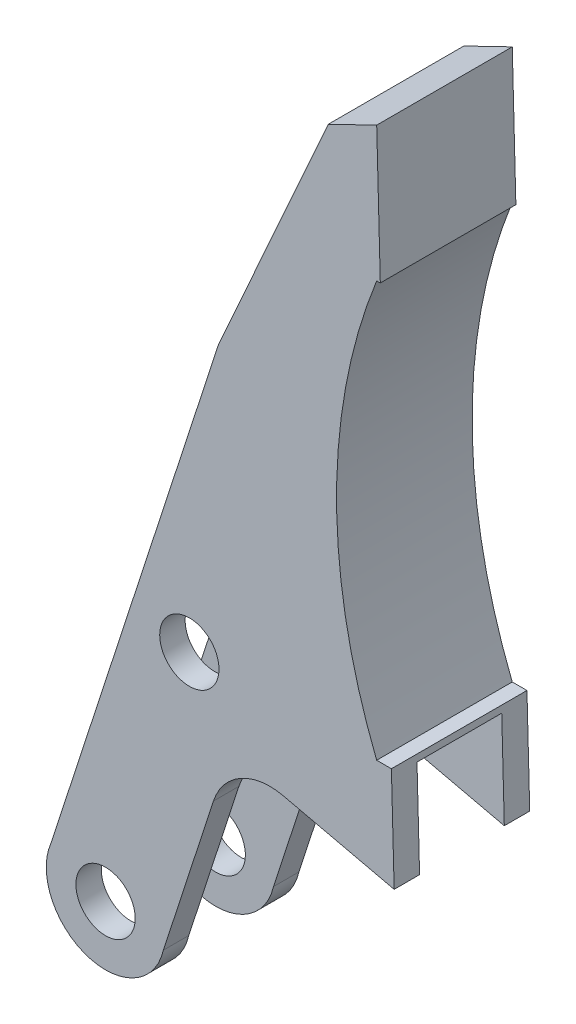
ISO-10303-21;
HEADER;
FILE_DESCRIPTION(('STEP AP214'),'2;1');
FILE_NAME('part.step','',(''),(''),'','','');
FILE_SCHEMA(('AUTOMOTIVE_DESIGN { 1 0 10303 214 1 1 1 1 }'));
ENDSEC;
DATA;
#1=APPLICATION_CONTEXT('core data for automotive mechanical design processes');
#2=APPLICATION_PROTOCOL_DEFINITION('international standard','automotive_design',2000,#1);
#3=PRODUCT_CONTEXT('',#1,'mechanical');
#4=PRODUCT('Part','Part','',(#3));
#5=PRODUCT_RELATED_PRODUCT_CATEGORY('part','',(#4));
#6=PRODUCT_DEFINITION_FORMATION('','',#4);
#7=PRODUCT_DEFINITION_CONTEXT('part definition',#1,'design');
#8=PRODUCT_DEFINITION('design','',#6,#7);
#9=PRODUCT_DEFINITION_SHAPE('','',#8);
#10=(LENGTH_UNIT() NAMED_UNIT(*) SI_UNIT(.MILLI.,.METRE.));
#11=(NAMED_UNIT(*) PLANE_ANGLE_UNIT() SI_UNIT($,.RADIAN.));
#12=(NAMED_UNIT(*) SI_UNIT($,.STERADIAN.) SOLID_ANGLE_UNIT());
#13=UNCERTAINTY_MEASURE_WITH_UNIT(LENGTH_MEASURE(1.E-05),#10,'distance_accuracy_value','');
#14=(GEOMETRIC_REPRESENTATION_CONTEXT(3) GLOBAL_UNCERTAINTY_ASSIGNED_CONTEXT((#13)) GLOBAL_UNIT_ASSIGNED_CONTEXT((#10,
#11,#12)) REPRESENTATION_CONTEXT('',''));
#15=CARTESIAN_POINT('',(0.,0.,0.));
#16=DIRECTION('',(0.,0.,1.));
#17=DIRECTION('',(1.,0.,0.));
#18=AXIS2_PLACEMENT_3D('',#15,#16,#17);
#19=CARTESIAN_POINT('',(-25.2846584394839,35.8883143881864,4.));
#20=DIRECTION('',(0.224951054343866,0.974370064785235,0.));
#21=DIRECTION('',(-0.974370064785235,0.224951054343866,0.));
#22=AXIS2_PLACEMENT_3D('',#19,#20,#21);
#23=PLANE('',#22);
#24=DIRECTION('',(0.,0.,-1.));
#25=VECTOR('',#24,1.);
#26=CARTESIAN_POINT('',(-25.2846584394839,35.8883143881864,4.));
#27=LINE('',#26,#25);
#28=CARTESIAN_POINT('',(-25.2846584394839,35.8883143881864,4.));
#29=VERTEX_POINT('',#28);
#30=CARTESIAN_POINT('',(-25.2846584394839,35.8883143881864,2.5));
#31=VERTEX_POINT('',#30);
#32=EDGE_CURVE('E197',#29,#31,#27,.T.);
#33=ORIENTED_EDGE('',*,*,#32,.T.);
#34=DIRECTION('',(0.974370064785235,-0.224951054343866,0.));
#35=VECTOR('',#34,1.);
#36=CARTESIAN_POINT('',(-25.2846584394839,35.8883143881864,2.5));
#37=LINE('',#36,#35);
#38=CARTESIAN_POINT('',(-18.7375603575919,34.3767976968983,2.5));
#39=VERTEX_POINT('',#38);
#40=EDGE_CURVE('E259',#31,#39,#37,.T.);
#41=ORIENTED_EDGE('',*,*,#40,.T.);
#42=DIRECTION('',(0.,0.,-1.));
#43=VECTOR('',#42,1.);
#44=CARTESIAN_POINT('',(-18.7375603575919,34.3767976968983,4.));
#45=LINE('',#44,#43);
#46=CARTESIAN_POINT('',(-18.7375603575919,34.3767976968983,4.));
#47=VERTEX_POINT('',#46);
#48=EDGE_CURVE('E38',#47,#39,#45,.T.);
#49=ORIENTED_EDGE('',*,*,#48,.F.);
#50=DIRECTION('',(0.974370064785235,-0.224951054343866,0.));
#51=VECTOR('',#50,1.);
#52=CARTESIAN_POINT('',(-25.2846584394839,35.8883143881864,4.));
#53=LINE('',#52,#51);
#54=EDGE_CURVE('E196',#29,#47,#53,.T.);
#55=ORIENTED_EDGE('',*,*,#54,.F.);
#56=EDGE_LOOP('',(#33,#41,#49,#55));
#57=FACE_BOUND('',#56,.T.);
#58=ADVANCED_FACE('F30',(#57),#23,.F.);
#59=CARTESIAN_POINT('',(-35.7688036623852,25.243662643469,4.));
#60=DIRECTION('',(0.,0.,-1.));
#61=DIRECTION('',(-1.,0.,0.));
#62=AXIS2_PLACEMENT_3D('',#59,#60,#61);
#63=CYLINDRICAL_SURFACE('',#62,3.5);
#64=DIRECTION('',(0.,0.,-1.));
#65=VECTOR('',#64,1.);
#66=CARTESIAN_POINT('',(-38.9905706494687,26.6112215931814,4.));
#67=LINE('',#66,#65);
#68=CARTESIAN_POINT('',(-38.9905706494687,26.6112215931814,4.));
#69=VERTEX_POINT('',#68);
#70=CARTESIAN_POINT('',(-38.9905706494687,26.6112215931814,2.5));
#71=VERTEX_POINT('',#70);
#72=EDGE_CURVE('E202',#69,#71,#67,.T.);
#73=ORIENTED_EDGE('',*,*,#72,.T.);
#74=CARTESIAN_POINT('',(-35.7688036623852,25.243662643469,2.5));
#75=DIRECTION('',(0.,0.,1.));
#76=DIRECTION('',(0.,-1.,0.));
#77=AXIS2_PLACEMENT_3D('',#74,#75,#76);
#78=CIRCLE('',#77,3.5);
#79=CARTESIAN_POINT('',(-32.3585084356369,24.4563339532654,2.5));
#80=VERTEX_POINT('',#79);
#81=EDGE_CURVE('E155',#71,#80,#78,.T.);
#82=ORIENTED_EDGE('',*,*,#81,.T.);
#83=DIRECTION('',(0.,0.,-1.));
#84=VECTOR('',#83,1.);
#85=CARTESIAN_POINT('',(-32.3585084356368,24.4563339532654,4.));
#86=LINE('',#85,#84);
#87=CARTESIAN_POINT('',(-32.3585084356368,24.4563339532654,4.));
#88=VERTEX_POINT('',#87);
#89=EDGE_CURVE('E151',#88,#80,#86,.T.);
#90=ORIENTED_EDGE('',*,*,#89,.F.);
#91=CARTESIAN_POINT('',(-35.7688036623852,25.243662643469,4.));
#92=DIRECTION('',(0.,0.,1.));
#93=DIRECTION('',(1.,0.,0.));
#94=AXIS2_PLACEMENT_3D('',#91,#92,#93);
#95=CIRCLE('',#94,3.5);
#96=EDGE_CURVE('E136',#69,#88,#95,.T.);
#97=ORIENTED_EDGE('',*,*,#96,.F.);
#98=EDGE_LOOP('',(#73,#82,#90,#97));
#99=FACE_BOUND('',#98,.T.);
#100=ADVANCED_FACE('F152',(#99),#63,.T.);
#101=CARTESIAN_POINT('',(-32.3585084356369,24.4563339532654,4.));
#102=DIRECTION('',(-0.951056516295153,0.309016994374949,0.));
#103=DIRECTION('',(-0.309016994374949,-0.951056516295153,0.));
#104=AXIS2_PLACEMENT_3D('',#101,#102,#103);
#105=PLANE('',#104);
#106=ORIENTED_EDGE('',*,*,#89,.T.);
#107=DIRECTION('',(0.309016994374949,0.951056516295153,0.));
#108=VECTOR('',#107,1.);
#109=CARTESIAN_POINT('',(-32.3585084356369,24.4563339532654,2.5));
#110=LINE('',#109,#108);
#111=CARTESIAN_POINT('',(-29.4006849367205,33.5595786417504,2.5));
#112=VERTEX_POINT('',#111);
#113=EDGE_CURVE('E253',#80,#112,#110,.T.);
#114=ORIENTED_EDGE('',*,*,#113,.T.);
#115=DIRECTION('',(0.,0.,-1.));
#116=VECTOR('',#115,1.);
#117=CARTESIAN_POINT('',(-29.4006849367205,33.5595786417504,4.));
#118=LINE('',#117,#116);
#119=CARTESIAN_POINT('',(-29.4006849367205,33.5595786417504,4.));
#120=VERTEX_POINT('',#119);
#121=EDGE_CURVE('E163',#120,#112,#118,.T.);
#122=ORIENTED_EDGE('',*,*,#121,.F.);
#123=DIRECTION('',(0.309016994374949,0.951056516295153,0.));
#124=VECTOR('',#123,1.);
#125=CARTESIAN_POINT('',(-32.3585084356369,24.4563339532654,4.));
#126=LINE('',#125,#124);
#127=EDGE_CURVE('E141',#88,#120,#126,.T.);
#128=ORIENTED_EDGE('',*,*,#127,.F.);
#129=EDGE_LOOP('',(#106,#114,#122,#128));
#130=FACE_BOUND('',#129,.T.);
#131=ADVANCED_FACE('F161',(#130),#105,.F.);
#132=CARTESIAN_POINT('',(-26.0719871296874,32.4780191614381,4.));
#133=DIRECTION('',(0.,0.,-1.));
#134=DIRECTION('',(-1.,0.,0.));
#135=AXIS2_PLACEMENT_3D('',#132,#133,#134);
#136=CYLINDRICAL_SURFACE('',#135,3.5);
#137=ORIENTED_EDGE('',*,*,#121,.T.);
#138=CARTESIAN_POINT('',(-26.0719871296874,32.4780191614381,2.5));
#139=DIRECTION('',(0.,0.,1.));
#140=DIRECTION('',(0.,-1.,0.));
#141=AXIS2_PLACEMENT_3D('',#138,#139,#140);
#142=CIRCLE('',#141,3.5);
#143=EDGE_CURVE('E238',#112,#31,#142,.F.);
#144=ORIENTED_EDGE('',*,*,#143,.T.);
#145=ORIENTED_EDGE('',*,*,#32,.F.);
#146=CARTESIAN_POINT('',(-26.0719871296874,32.4780191614381,4.));
#147=DIRECTION('',(0.,0.,-1.));
#148=DIRECTION('',(-1.,0.,0.));
#149=AXIS2_PLACEMENT_3D('',#146,#147,#148);
#150=CIRCLE('',#149,3.5);
#151=EDGE_CURVE('E54',#120,#29,#150,.T.);
#152=ORIENTED_EDGE('',*,*,#151,.F.);
#153=EDGE_LOOP('',(#137,#144,#145,#152));
#154=FACE_BOUND('',#153,.T.);
#155=ADVANCED_FACE('F348',(#154),#136,.F.);
#156=CARTESIAN_POINT('',(-30.824531752386,40.4605669041914,4.));
#157=DIRECTION('',(0.,0.,-1.));
#158=DIRECTION('',(-1.,0.,0.));
#159=AXIS2_PLACEMENT_3D('',#156,#157,#158);
#160=CYLINDRICAL_SURFACE('',#159,1.75);
#161=CARTESIAN_POINT('',(-30.824531752386,40.4605669041914,2.5));
#162=DIRECTION('',(0.,0.,1.));
#163=DIRECTION('',(0.,-1.,0.));
#164=AXIS2_PLACEMENT_3D('',#161,#162,#163);
#165=CIRCLE('',#164,1.75);
#166=CARTESIAN_POINT('',(-30.824531752386,38.7105669041914,2.5));
#167=VERTEX_POINT('',#166);
#168=EDGE_CURVE('E233',#167,#167,#165,.T.);
#169=ORIENTED_EDGE('',*,*,#168,.F.);
#170=EDGE_LOOP('',(#169));
#171=FACE_BOUND('',#170,.T.);
#172=CARTESIAN_POINT('',(-30.824531752386,40.4605669041914,4.));
#173=DIRECTION('',(0.,0.,1.));
#174=DIRECTION('',(-1.,0.,0.));
#175=AXIS2_PLACEMENT_3D('',#172,#173,#174);
#176=CIRCLE('',#175,1.75);
#177=CARTESIAN_POINT('',(-32.574531752386,40.4605669041914,4.));
#178=VERTEX_POINT('',#177);
#179=EDGE_CURVE('E171',#178,#178,#176,.T.);
#180=ORIENTED_EDGE('',*,*,#179,.T.);
#181=EDGE_LOOP('',(#180));
#182=FACE_BOUND('',#181,.T.);
#183=ADVANCED_FACE('F350',(#171,#182),#160,.F.);
#184=CARTESIAN_POINT('',(-35.7688036623852,25.243662643469,4.));
#185=DIRECTION('',(0.,0.,-1.));
#186=DIRECTION('',(-1.,0.,0.));
#187=AXIS2_PLACEMENT_3D('',#184,#185,#186);
#188=CYLINDRICAL_SURFACE('',#187,1.75);
#189=CARTESIAN_POINT('',(-35.7688036623852,25.243662643469,2.5));
#190=DIRECTION('',(0.,0.,1.));
#191=DIRECTION('',(0.,-1.,0.));
#192=AXIS2_PLACEMENT_3D('',#189,#190,#191);
#193=CIRCLE('',#192,1.75);
#194=CARTESIAN_POINT('',(-35.7688036623852,23.493662643469,2.5));
#195=VERTEX_POINT('',#194);
#196=EDGE_CURVE('E231',#195,#195,#193,.T.);
#197=ORIENTED_EDGE('',*,*,#196,.F.);
#198=EDGE_LOOP('',(#197));
#199=FACE_BOUND('',#198,.T.);
#200=CARTESIAN_POINT('',(-35.7688036623852,25.243662643469,4.));
#201=DIRECTION('',(0.,0.,1.));
#202=DIRECTION('',(-1.,0.,0.));
#203=AXIS2_PLACEMENT_3D('',#200,#201,#202);
#204=CIRCLE('',#203,1.75);
#205=CARTESIAN_POINT('',(-37.5188036623852,25.243662643469,4.));
#206=VERTEX_POINT('',#205);
#207=EDGE_CURVE('E268',#206,#206,#204,.T.);
#208=ORIENTED_EDGE('',*,*,#207,.T.);
#209=EDGE_LOOP('',(#208));
#210=FACE_BOUND('',#209,.T.);
#211=ADVANCED_FACE('F357',(#199,#210),#188,.F.);
#212=CARTESIAN_POINT('',(10.7416775011189,52.7102533979075,4.));
#213=DIRECTION('',(0.,0.,1.));
#214=DIRECTION('',(1.,0.,0.));
#215=AXIS2_PLACEMENT_3D('',#212,#213,#214);
#216=PLANE('',#215);
#217=ORIENTED_EDGE('',*,*,#179,.F.);
#218=EDGE_LOOP('',(#217));
#219=FACE_BOUND('',#218,.T.);
#220=ORIENTED_EDGE('',*,*,#54,.T.);
#221=DIRECTION('',(-0.0267182789025263,0.999643003062837,0.));
#222=VECTOR('',#221,1.);
#223=CARTESIAN_POINT('',(-18.9001662498565,40.4605669041914,4.));
#224=LINE('',#223,#222);
#225=CARTESIAN_POINT('',(-18.9001662498565,40.4605669041914,4.));
#226=VERTEX_POINT('',#225);
#227=EDGE_CURVE('E109',#47,#226,#224,.T.);
#228=ORIENTED_EDGE('',*,*,#227,.T.);
#229=DIRECTION('',(-1.,0.,0.));
#230=VECTOR('',#229,1.);
#231=CARTESIAN_POINT('',(-19.7688036623852,40.4605669041914,4.));
#232=LINE('',#231,#230);
#233=CARTESIAN_POINT('',(-19.7688036623852,40.4605669041914,4.));
#234=VERTEX_POINT('',#233);
#235=EDGE_CURVE('E280',#226,#234,#232,.T.);
#236=ORIENTED_EDGE('',*,*,#235,.T.);
#237=CARTESIAN_POINT('',(10.7416775011189,52.7102533979075,4.));
#238=DIRECTION('',(0.,0.,-1.));
#239=DIRECTION('',(1.,0.,0.));
#240=AXIS2_PLACEMENT_3D('',#237,#238,#239);
#241=CIRCLE('',#240,32.8777170743784);
#242=CARTESIAN_POINT('',(-19.7688036623852,64.9599398916236,4.));
#243=VERTEX_POINT('',#242);
#244=EDGE_CURVE('E282',#234,#243,#241,.T.);
#245=ORIENTED_EDGE('',*,*,#244,.T.);
#246=DIRECTION('',(1.,0.,0.));
#247=VECTOR('',#246,1.);
#248=CARTESIAN_POINT('',(-19.7688036623852,64.9599398916236,4.));
#249=LINE('',#248,#247);
#250=CARTESIAN_POINT('',(-19.5549810971666,64.9599398916236,4.));
#251=VERTEX_POINT('',#250);
#252=EDGE_CURVE('E284',#243,#251,#249,.T.);
#253=ORIENTED_EDGE('',*,*,#252,.T.);
#254=DIRECTION('',(-0.0267182789025262,0.999643003062837,0.));
#255=VECTOR('',#254,1.);
#256=CARTESIAN_POINT('',(-19.5549810971666,64.9599398916236,4.));
#257=LINE('',#256,#255);
#258=CARTESIAN_POINT('',(-19.7677397787771,72.9201355385332,4.));
#259=VERTEX_POINT('',#258);
#260=EDGE_CURVE('E286',#251,#259,#257,.T.);
#261=ORIENTED_EDGE('',*,*,#260,.T.);
#262=DIRECTION('',(-0.899848945038772,-0.436201646159903,0.));
#263=VECTOR('',#262,1.);
#264=CARTESIAN_POINT('',(-22.6270522669479,71.5340842228071,4.));
#265=LINE('',#264,#263);
#266=CARTESIAN_POINT('',(-22.6270522669479,71.5340842228071,4.));
#267=VERTEX_POINT('',#266);
#268=EDGE_CURVE('E288',#259,#267,#265,.T.);
#269=ORIENTED_EDGE('',*,*,#268,.T.);
#270=DIRECTION('',(-0.407987304673791,-0.912987600805737,0.));
#271=VECTOR('',#270,1.);
#272=CARTESIAN_POINT('',(-22.6270522669479,71.5340842228071,4.));
#273=LINE('',#272,#271);
#274=CARTESIAN_POINT('',(-29.1026728136602,57.0430419797201,4.));
#275=VERTEX_POINT('',#274);
#276=EDGE_CURVE('E290',#267,#275,#273,.T.);
#277=ORIENTED_EDGE('',*,*,#276,.T.);
#278=DIRECTION('',(-0.309016994374949,-0.951056516295153,0.));
#279=VECTOR('',#278,1.);
#280=CARTESIAN_POINT('',(-38.9905706494687,26.6112215931814,4.));
#281=LINE('',#280,#279);
#282=EDGE_CURVE('E144',#275,#69,#281,.T.);
#283=ORIENTED_EDGE('',*,*,#282,.T.);
#284=ORIENTED_EDGE('',*,*,#96,.T.);
#285=ORIENTED_EDGE('',*,*,#127,.T.);
#286=ORIENTED_EDGE('',*,*,#151,.T.);
#287=EDGE_LOOP('',(#220,#228,#236,#245,#253,#261,#269,#277,#283,#284,#285,#286));
#288=FACE_BOUND('',#287,.T.);
#289=ORIENTED_EDGE('',*,*,#207,.F.);
#290=EDGE_LOOP('',(#289));
#291=FACE_BOUND('',#290,.T.);
#292=ADVANCED_FACE('F138',(#219,#288,#291),#216,.T.);
#293=CARTESIAN_POINT('',(10.7416775011189,52.7102533979075,-4.));
#294=DIRECTION('',(0.,0.,1.));
#295=DIRECTION('',(1.,0.,0.));
#296=AXIS2_PLACEMENT_3D('',#293,#294,#295);
#297=PLANE('',#296);
#298=CARTESIAN_POINT('',(-30.824531752386,40.4605669041914,-4.));
#299=DIRECTION('',(0.,0.,1.));
#300=DIRECTION('',(-1.,0.,0.));
#301=AXIS2_PLACEMENT_3D('',#298,#299,#300);
#302=CIRCLE('',#301,1.75);
#303=CARTESIAN_POINT('',(-32.574531752386,40.4605669041914,-4.));
#304=VERTEX_POINT('',#303);
#305=EDGE_CURVE('E271',#304,#304,#302,.T.);
#306=ORIENTED_EDGE('',*,*,#305,.T.);
#307=EDGE_LOOP('',(#306));
#308=FACE_BOUND('',#307,.T.);
#309=DIRECTION('',(0.974370064785235,-0.224951054343866,0.));
#310=VECTOR('',#309,1.);
#311=CARTESIAN_POINT('',(-25.2846584394839,35.8883143881864,-4.));
#312=LINE('',#311,#310);
#313=CARTESIAN_POINT('',(-25.2846584394839,35.8883143881864,-4.));
#314=VERTEX_POINT('',#313);
#315=CARTESIAN_POINT('',(-18.7375603575919,34.3767976968983,-4.));
#316=VERTEX_POINT('',#315);
#317=EDGE_CURVE('E168',#314,#316,#312,.T.);
#318=ORIENTED_EDGE('',*,*,#317,.F.);
#319=CARTESIAN_POINT('',(-26.0719871296874,32.4780191614381,-4.));
#320=DIRECTION('',(0.,0.,-1.));
#321=DIRECTION('',(-1.,0.,0.));
#322=AXIS2_PLACEMENT_3D('',#319,#320,#321);
#323=CIRCLE('',#322,3.5);
#324=CARTESIAN_POINT('',(-29.4006849367205,33.5595786417504,-4.));
#325=VERTEX_POINT('',#324);
#326=EDGE_CURVE('E194',#325,#314,#323,.T.);
#327=ORIENTED_EDGE('',*,*,#326,.F.);
#328=DIRECTION('',(0.309016994374949,0.951056516295153,0.));
#329=VECTOR('',#328,1.);
#330=CARTESIAN_POINT('',(-32.3585084356369,24.4563339532654,-4.));
#331=LINE('',#330,#329);
#332=CARTESIAN_POINT('',(-32.3585084356368,24.4563339532654,-4.));
#333=VERTEX_POINT('',#332);
#334=EDGE_CURVE('E191',#333,#325,#331,.T.);
#335=ORIENTED_EDGE('',*,*,#334,.F.);
#336=CARTESIAN_POINT('',(-35.7688036623852,25.243662643469,-4.));
#337=DIRECTION('',(0.,0.,1.));
#338=DIRECTION('',(1.,0.,0.));
#339=AXIS2_PLACEMENT_3D('',#336,#337,#338);
#340=CIRCLE('',#339,3.5);
#341=CARTESIAN_POINT('',(-38.9905706494687,26.6112215931814,-4.));
#342=VERTEX_POINT('',#341);
#343=EDGE_CURVE('E188',#342,#333,#340,.T.);
#344=ORIENTED_EDGE('',*,*,#343,.F.);
#345=DIRECTION('',(-0.309016994374949,-0.951056516295153,0.));
#346=VECTOR('',#345,1.);
#347=CARTESIAN_POINT('',(-38.9905706494687,26.6112215931814,-4.));
#348=LINE('',#347,#346);
#349=CARTESIAN_POINT('',(-29.1026728136602,57.0430419797201,-4.));
#350=VERTEX_POINT('',#349);
#351=EDGE_CURVE('E185',#350,#342,#348,.T.);
#352=ORIENTED_EDGE('',*,*,#351,.F.);
#353=DIRECTION('',(-0.407987304673791,-0.912987600805737,0.));
#354=VECTOR('',#353,1.);
#355=CARTESIAN_POINT('',(-22.6270522669479,71.5340842228071,-4.));
#356=LINE('',#355,#354);
#357=CARTESIAN_POINT('',(-22.6270522669479,71.5340842228071,-4.));
#358=VERTEX_POINT('',#357);
#359=EDGE_CURVE('E183',#358,#350,#356,.T.);
#360=ORIENTED_EDGE('',*,*,#359,.F.);
#361=DIRECTION('',(-0.899848945038772,-0.436201646159903,0.));
#362=VECTOR('',#361,1.);
#363=CARTESIAN_POINT('',(-22.6270522669479,71.5340842228071,-4.));
#364=LINE('',#363,#362);
#365=CARTESIAN_POINT('',(-19.7677397787771,72.9201355385332,-4.));
#366=VERTEX_POINT('',#365);
#367=EDGE_CURVE('E181',#366,#358,#364,.T.);
#368=ORIENTED_EDGE('',*,*,#367,.F.);
#369=DIRECTION('',(-0.0267182789025262,0.999643003062837,0.));
#370=VECTOR('',#369,1.);
#371=CARTESIAN_POINT('',(-19.5549810971666,64.9599398916236,-4.));
#372=LINE('',#371,#370);
#373=CARTESIAN_POINT('',(-19.5549810971666,64.9599398916236,-4.));
#374=VERTEX_POINT('',#373);
#375=EDGE_CURVE('E179',#374,#366,#372,.T.);
#376=ORIENTED_EDGE('',*,*,#375,.F.);
#377=DIRECTION('',(1.,0.,0.));
#378=VECTOR('',#377,1.);
#379=CARTESIAN_POINT('',(-19.7688036623852,64.9599398916236,-4.));
#380=LINE('',#379,#378);
#381=CARTESIAN_POINT('',(-19.7688036623852,64.9599398916236,-4.));
#382=VERTEX_POINT('',#381);
#383=EDGE_CURVE('E177',#382,#374,#380,.T.);
#384=ORIENTED_EDGE('',*,*,#383,.F.);
#385=CARTESIAN_POINT('',(10.7416775011189,52.7102533979075,-4.));
#386=DIRECTION('',(0.,0.,-1.));
#387=DIRECTION('',(1.,0.,0.));
#388=AXIS2_PLACEMENT_3D('',#385,#386,#387);
#389=CIRCLE('',#388,32.8777170743784);
#390=CARTESIAN_POINT('',(-19.7688036623852,40.4605669041914,-4.));
#391=VERTEX_POINT('',#390);
#392=EDGE_CURVE('E175',#391,#382,#389,.T.);
#393=ORIENTED_EDGE('',*,*,#392,.F.);
#394=DIRECTION('',(-1.,0.,0.));
#395=VECTOR('',#394,1.);
#396=CARTESIAN_POINT('',(-19.7688036623852,40.4605669041914,-4.));
#397=LINE('',#396,#395);
#398=CARTESIAN_POINT('',(-18.9001662498565,40.4605669041914,-4.));
#399=VERTEX_POINT('',#398);
#400=EDGE_CURVE('E173',#399,#391,#397,.T.);
#401=ORIENTED_EDGE('',*,*,#400,.F.);
#402=DIRECTION('',(-0.0267182789025263,0.999643003062837,0.));
#403=VECTOR('',#402,1.);
#404=CARTESIAN_POINT('',(-18.9001662498565,40.4605669041914,-4.));
#405=LINE('',#404,#403);
#406=EDGE_CURVE('E170',#316,#399,#405,.T.);
#407=ORIENTED_EDGE('',*,*,#406,.F.);
#408=EDGE_LOOP('',(#318,#327,#335,#344,#352,#360,#368,#376,#384,#393,#401,#407));
#409=FACE_BOUND('',#408,.T.);
#410=CARTESIAN_POINT('',(-35.7688036623852,25.243662643469,-4.));
#411=DIRECTION('',(0.,0.,1.));
#412=DIRECTION('',(-1.,0.,0.));
#413=AXIS2_PLACEMENT_3D('',#410,#411,#412);
#414=CIRCLE('',#413,1.75);
#415=CARTESIAN_POINT('',(-37.5188036623852,25.243662643469,-4.));
#416=VERTEX_POINT('',#415);
#417=EDGE_CURVE('E267',#416,#416,#414,.T.);
#418=ORIENTED_EDGE('',*,*,#417,.T.);
#419=EDGE_LOOP('',(#418));
#420=FACE_BOUND('',#419,.T.);
#421=ADVANCED_FACE('F373',(#308,#409,#420),#297,.F.);
#422=CARTESIAN_POINT('',(-18.7375603575919,34.3767976968983,-2.5));
#423=VERTEX_POINT('',#422);
#424=EDGE_CURVE('E225',#423,#316,#45,.T.);
#425=ORIENTED_EDGE('',*,*,#424,.F.);
#426=DIRECTION('',(-0.974370064785235,0.224951054343866,0.));
#427=VECTOR('',#426,1.);
#428=CARTESIAN_POINT('',(-25.2846584394839,35.8883143881864,-2.5));
#429=LINE('',#428,#427);
#430=CARTESIAN_POINT('',(-25.2846584394839,35.8883143881864,-2.5));
#431=VERTEX_POINT('',#430);
#432=EDGE_CURVE('E241',#423,#431,#429,.T.);
#433=ORIENTED_EDGE('',*,*,#432,.T.);
#434=EDGE_CURVE('E100',#431,#314,#27,.T.);
#435=ORIENTED_EDGE('',*,*,#434,.T.);
#436=ORIENTED_EDGE('',*,*,#317,.T.);
#437=EDGE_LOOP('',(#425,#433,#435,#436));
#438=FACE_BOUND('',#437,.T.);
#439=ADVANCED_FACE('F32',(#438),#23,.F.);
#440=CARTESIAN_POINT('',(-18.9001662498565,40.4605669041914,4.));
#441=DIRECTION('',(-0.999643003062837,-0.0267182789025263,0.));
#442=DIRECTION('',(0.0267182789025263,-0.999643003062837,0.));
#443=AXIS2_PLACEMENT_3D('',#440,#441,#442);
#444=PLANE('',#443);
#445=ORIENTED_EDGE('',*,*,#48,.T.);
#446=DIRECTION('',(-0.0267182789025263,0.999643003062837,0.));
#447=VECTOR('',#446,1.);
#448=CARTESIAN_POINT('',(-18.9001662498565,40.4605669041914,2.5));
#449=LINE('',#448,#447);
#450=CARTESIAN_POINT('',(-18.8893402327182,40.0555201448972,2.5));
#451=VERTEX_POINT('',#450);
#452=EDGE_CURVE('E262',#39,#451,#449,.T.);
#453=ORIENTED_EDGE('',*,*,#452,.T.);
#454=DIRECTION('',(0.,0.,-1.));
#455=VECTOR('',#454,1.);
#456=CARTESIAN_POINT('',(-18.8893402327182,40.0555201448972,4.));
#457=LINE('',#456,#455);
#458=CARTESIAN_POINT('',(-18.8893402327182,40.0555201448972,-2.5));
#459=VERTEX_POINT('',#458);
#460=EDGE_CURVE('E265',#451,#459,#457,.T.);
#461=ORIENTED_EDGE('',*,*,#460,.T.);
#462=DIRECTION('',(0.0267182789025263,-0.999643003062837,0.));
#463=VECTOR('',#462,1.);
#464=CARTESIAN_POINT('',(-18.9001662498565,40.4605669041914,-2.5));
#465=LINE('',#464,#463);
#466=EDGE_CURVE('E234',#459,#423,#465,.T.);
#467=ORIENTED_EDGE('',*,*,#466,.T.);
#468=ORIENTED_EDGE('',*,*,#424,.T.);
#469=ORIENTED_EDGE('',*,*,#406,.T.);
#470=DIRECTION('',(0.,0.,-1.));
#471=VECTOR('',#470,1.);
#472=CARTESIAN_POINT('',(-18.9001662498565,40.4605669041914,4.));
#473=LINE('',#472,#471);
#474=EDGE_CURVE('E222',#226,#399,#473,.T.);
#475=ORIENTED_EDGE('',*,*,#474,.F.);
#476=ORIENTED_EDGE('',*,*,#227,.F.);
#477=EDGE_LOOP('',(#445,#453,#461,#467,#468,#469,#475,#476));
#478=FACE_BOUND('',#477,.T.);
#479=ADVANCED_FACE('F342',(#478),#444,.F.);
#480=CARTESIAN_POINT('',(-19.7688036623852,40.4605669041914,4.));
#481=DIRECTION('',(0.,-1.,0.));
#482=DIRECTION('',(0.,0.,-1.));
#483=AXIS2_PLACEMENT_3D('',#480,#481,#482);
#484=PLANE('',#483);
#485=ORIENTED_EDGE('',*,*,#400,.T.);
#486=DIRECTION('',(0.,0.,-1.));
#487=VECTOR('',#486,1.);
#488=CARTESIAN_POINT('',(-19.7688036623852,40.4605669041914,4.));
#489=LINE('',#488,#487);
#490=EDGE_CURVE('E219',#234,#391,#489,.T.);
#491=ORIENTED_EDGE('',*,*,#490,.F.);
#492=ORIENTED_EDGE('',*,*,#235,.F.);
#493=ORIENTED_EDGE('',*,*,#474,.T.);
#494=EDGE_LOOP('',(#485,#491,#492,#493));
#495=FACE_BOUND('',#494,.T.);
#496=ADVANCED_FACE('F378',(#495),#484,.F.);
#497=CARTESIAN_POINT('',(10.7416775011189,52.7102533979075,4.));
#498=DIRECTION('',(0.,0.,-1.));
#499=DIRECTION('',(-1.,0.,0.));
#500=AXIS2_PLACEMENT_3D('',#497,#498,#499);
#501=CYLINDRICAL_SURFACE('',#500,32.8777170743784);
#502=ORIENTED_EDGE('',*,*,#392,.T.);
#503=DIRECTION('',(0.,0.,-1.));
#504=VECTOR('',#503,1.);
#505=CARTESIAN_POINT('',(-19.7688036623852,64.9599398916236,4.));
#506=LINE('',#505,#504);
#507=EDGE_CURVE('E216',#243,#382,#506,.T.);
#508=ORIENTED_EDGE('',*,*,#507,.F.);
#509=ORIENTED_EDGE('',*,*,#244,.F.);
#510=ORIENTED_EDGE('',*,*,#490,.T.);
#511=EDGE_LOOP('',(#502,#508,#509,#510));
#512=FACE_BOUND('',#511,.T.);
#513=ADVANCED_FACE('F393',(#512),#501,.F.);
#514=CARTESIAN_POINT('',(-19.7688036623852,64.9599398916236,4.));
#515=DIRECTION('',(0.,1.,0.));
#516=DIRECTION('',(0.,0.,1.));
#517=AXIS2_PLACEMENT_3D('',#514,#515,#516);
#518=PLANE('',#517);
#519=ORIENTED_EDGE('',*,*,#383,.T.);
#520=DIRECTION('',(0.,0.,-1.));
#521=VECTOR('',#520,1.);
#522=CARTESIAN_POINT('',(-19.5549810971666,64.9599398916236,4.));
#523=LINE('',#522,#521);
#524=EDGE_CURVE('E213',#251,#374,#523,.T.);
#525=ORIENTED_EDGE('',*,*,#524,.F.);
#526=ORIENTED_EDGE('',*,*,#252,.F.);
#527=ORIENTED_EDGE('',*,*,#507,.T.);
#528=EDGE_LOOP('',(#519,#525,#526,#527));
#529=FACE_BOUND('',#528,.T.);
#530=ADVANCED_FACE('F400',(#529),#518,.F.);
#531=CARTESIAN_POINT('',(-19.5549810971666,64.9599398916236,4.));
#532=DIRECTION('',(-0.999643003062837,-0.0267182789025262,0.));
#533=DIRECTION('',(0.0267182789025262,-0.999643003062837,0.));
#534=AXIS2_PLACEMENT_3D('',#531,#532,#533);
#535=PLANE('',#534);
#536=ORIENTED_EDGE('',*,*,#375,.T.);
#537=DIRECTION('',(0.,0.,-1.));
#538=VECTOR('',#537,1.);
#539=CARTESIAN_POINT('',(-19.7677397787771,72.9201355385332,4.));
#540=LINE('',#539,#538);
#541=EDGE_CURVE('E210',#259,#366,#540,.T.);
#542=ORIENTED_EDGE('',*,*,#541,.F.);
#543=ORIENTED_EDGE('',*,*,#260,.F.);
#544=ORIENTED_EDGE('',*,*,#524,.T.);
#545=EDGE_LOOP('',(#536,#542,#543,#544));
#546=FACE_BOUND('',#545,.T.);
#547=ADVANCED_FACE('F403',(#546),#535,.F.);
#548=CARTESIAN_POINT('',(-22.6270522669479,71.5340842228071,4.));
#549=DIRECTION('',(0.436201646159903,-0.899848945038772,0.));
#550=DIRECTION('',(0.899848945038772,0.436201646159903,0.));
#551=AXIS2_PLACEMENT_3D('',#548,#549,#550);
#552=PLANE('',#551);
#553=ORIENTED_EDGE('',*,*,#367,.T.);
#554=DIRECTION('',(0.,0.,-1.));
#555=VECTOR('',#554,1.);
#556=CARTESIAN_POINT('',(-22.6270522669479,71.5340842228071,4.));
#557=LINE('',#556,#555);
#558=EDGE_CURVE('E207',#267,#358,#557,.T.);
#559=ORIENTED_EDGE('',*,*,#558,.F.);
#560=ORIENTED_EDGE('',*,*,#268,.F.);
#561=ORIENTED_EDGE('',*,*,#541,.T.);
#562=EDGE_LOOP('',(#553,#559,#560,#561));
#563=FACE_BOUND('',#562,.T.);
#564=ADVANCED_FACE('F406',(#563),#552,.F.);
#565=CARTESIAN_POINT('',(-22.6270522669479,71.5340842228071,4.));
#566=DIRECTION('',(0.912987600805737,-0.407987304673791,0.));
#567=DIRECTION('',(0.407987304673791,0.912987600805737,0.));
#568=AXIS2_PLACEMENT_3D('',#565,#566,#567);
#569=PLANE('',#568);
#570=ORIENTED_EDGE('',*,*,#359,.T.);
#571=DIRECTION('',(0.,0.,-1.));
#572=VECTOR('',#571,1.);
#573=CARTESIAN_POINT('',(-29.1026728136602,57.0430419797201,4.));
#574=LINE('',#573,#572);
#575=EDGE_CURVE('E204',#275,#350,#574,.T.);
#576=ORIENTED_EDGE('',*,*,#575,.F.);
#577=ORIENTED_EDGE('',*,*,#276,.F.);
#578=ORIENTED_EDGE('',*,*,#558,.T.);
#579=EDGE_LOOP('',(#570,#576,#577,#578));
#580=FACE_BOUND('',#579,.T.);
#581=ADVANCED_FACE('F296',(#580),#569,.F.);
#582=CARTESIAN_POINT('',(-38.9905706494687,26.6112215931814,4.));
#583=DIRECTION('',(0.951056516295153,-0.309016994374949,0.));
#584=DIRECTION('',(0.309016994374949,0.951056516295153,0.));
#585=AXIS2_PLACEMENT_3D('',#582,#583,#584);
#586=PLANE('',#585);
#587=DIRECTION('',(0.,0.,1.));
#588=VECTOR('',#587,1.);
#589=CARTESIAN_POINT('',(-33.1198937405345,44.6793072678831,4.));
#590=LINE('',#589,#588);
#591=CARTESIAN_POINT('',(-33.1198937405345,44.6793072678831,-2.5));
#592=VERTEX_POINT('',#591);
#593=CARTESIAN_POINT('',(-33.1198937405345,44.6793072678831,2.5));
#594=VERTEX_POINT('',#593);
#595=EDGE_CURVE('E11',#592,#594,#590,.T.);
#596=ORIENTED_EDGE('',*,*,#595,.T.);
#597=DIRECTION('',(-0.309016994374949,-0.951056516295153,0.));
#598=VECTOR('',#597,1.);
#599=CARTESIAN_POINT('',(-38.9905706494687,26.6112215931814,2.5));
#600=LINE('',#599,#598);
#601=EDGE_CURVE('E256',#594,#71,#600,.T.);
#602=ORIENTED_EDGE('',*,*,#601,.T.);
#603=ORIENTED_EDGE('',*,*,#72,.F.);
#604=ORIENTED_EDGE('',*,*,#282,.F.);
#605=ORIENTED_EDGE('',*,*,#575,.T.);
#606=ORIENTED_EDGE('',*,*,#351,.T.);
#607=CARTESIAN_POINT('',(-38.9905706494687,26.6112215931814,-2.5));
#608=VERTEX_POINT('',#607);
#609=EDGE_CURVE('E158',#608,#342,#67,.T.);
#610=ORIENTED_EDGE('',*,*,#609,.F.);
#611=DIRECTION('',(0.309016994374949,0.951056516295153,0.));
#612=VECTOR('',#611,1.);
#613=CARTESIAN_POINT('',(-38.9905706494687,26.6112215931814,-2.5));
#614=LINE('',#613,#612);
#615=EDGE_CURVE('E247',#608,#592,#614,.T.);
#616=ORIENTED_EDGE('',*,*,#615,.T.);
#617=EDGE_LOOP('',(#596,#602,#603,#604,#605,#606,#610,#616));
#618=FACE_BOUND('',#617,.T.);
#619=ADVANCED_FACE('F300',(#618),#586,.F.);
#620=CARTESIAN_POINT('',(-32.3585084356369,24.4563339532654,-2.5));
#621=VERTEX_POINT('',#620);
#622=EDGE_CURVE('E159',#621,#333,#86,.T.);
#623=ORIENTED_EDGE('',*,*,#622,.F.);
#624=CARTESIAN_POINT('',(-35.7688036623852,25.243662643469,-2.5));
#625=DIRECTION('',(0.,0.,-1.));
#626=DIRECTION('',(0.,1.,0.));
#627=AXIS2_PLACEMENT_3D('',#624,#625,#626);
#628=CIRCLE('',#627,3.5);
#629=EDGE_CURVE('E413',#621,#608,#628,.T.);
#630=ORIENTED_EDGE('',*,*,#629,.T.);
#631=ORIENTED_EDGE('',*,*,#609,.T.);
#632=ORIENTED_EDGE('',*,*,#343,.T.);
#633=EDGE_LOOP('',(#623,#630,#631,#632));
#634=FACE_BOUND('',#633,.T.);
#635=ADVANCED_FACE('F371',(#634),#63,.T.);
#636=CARTESIAN_POINT('',(-29.4006849367205,33.5595786417504,-2.5));
#637=VERTEX_POINT('',#636);
#638=EDGE_CURVE('E200',#637,#325,#118,.T.);
#639=ORIENTED_EDGE('',*,*,#638,.F.);
#640=DIRECTION('',(-0.309016994374949,-0.951056516295153,0.));
#641=VECTOR('',#640,1.);
#642=CARTESIAN_POINT('',(-32.3585084356369,24.4563339532654,-2.5));
#643=LINE('',#642,#641);
#644=EDGE_CURVE('E45',#637,#621,#643,.T.);
#645=ORIENTED_EDGE('',*,*,#644,.T.);
#646=ORIENTED_EDGE('',*,*,#622,.T.);
#647=ORIENTED_EDGE('',*,*,#334,.T.);
#648=EDGE_LOOP('',(#639,#645,#646,#647));
#649=FACE_BOUND('',#648,.T.);
#650=ADVANCED_FACE('F362',(#649),#105,.F.);
#651=ORIENTED_EDGE('',*,*,#434,.F.);
#652=CARTESIAN_POINT('',(-26.0719871296874,32.4780191614381,-2.5));
#653=DIRECTION('',(0.,0.,-1.));
#654=DIRECTION('',(0.,1.,0.));
#655=AXIS2_PLACEMENT_3D('',#652,#653,#654);
#656=CIRCLE('',#655,3.5);
#657=EDGE_CURVE('E415',#431,#637,#656,.F.);
#658=ORIENTED_EDGE('',*,*,#657,.T.);
#659=ORIENTED_EDGE('',*,*,#638,.T.);
#660=ORIENTED_EDGE('',*,*,#326,.T.);
#661=EDGE_LOOP('',(#651,#658,#659,#660));
#662=FACE_BOUND('',#661,.T.);
#663=ADVANCED_FACE('F352',(#662),#136,.F.);
#664=CARTESIAN_POINT('',(-30.824531752386,40.4605669041914,-2.5));
#665=DIRECTION('',(0.,0.,-1.));
#666=DIRECTION('',(0.,1.,0.));
#667=AXIS2_PLACEMENT_3D('',#664,#665,#666);
#668=CIRCLE('',#667,1.75);
#669=CARTESIAN_POINT('',(-30.824531752386,42.2105669041914,-2.5));
#670=VERTEX_POINT('',#669);
#671=EDGE_CURVE('E229',#670,#670,#668,.T.);
#672=ORIENTED_EDGE('',*,*,#671,.F.);
#673=EDGE_LOOP('',(#672));
#674=FACE_BOUND('',#673,.T.);
#675=ORIENTED_EDGE('',*,*,#305,.F.);
#676=EDGE_LOOP('',(#675));
#677=FACE_BOUND('',#676,.T.);
#678=ADVANCED_FACE('F360',(#674,#677),#160,.F.);
#679=CARTESIAN_POINT('',(-35.7688036623852,25.243662643469,-2.5));
#680=DIRECTION('',(0.,0.,-1.));
#681=DIRECTION('',(0.,1.,0.));
#682=AXIS2_PLACEMENT_3D('',#679,#680,#681);
#683=CIRCLE('',#682,1.75);
#684=CARTESIAN_POINT('',(-35.7688036623852,26.993662643469,-2.5));
#685=VERTEX_POINT('',#684);
#686=EDGE_CURVE('E227',#685,#685,#683,.T.);
#687=ORIENTED_EDGE('',*,*,#686,.F.);
#688=EDGE_LOOP('',(#687));
#689=FACE_BOUND('',#688,.T.);
#690=ORIENTED_EDGE('',*,*,#417,.F.);
#691=EDGE_LOOP('',(#690));
#692=FACE_BOUND('',#691,.T.);
#693=ADVANCED_FACE('F426',(#689,#692),#188,.F.);
#694=CARTESIAN_POINT('',(-15.5380148891913,38.9666085323009,-2.5));
#695=DIRECTION('',(0.309016994374948,0.951056516295153,0.));
#696=DIRECTION('',(-0.951056516295153,0.309016994374948,0.));
#697=AXIS2_PLACEMENT_3D('',#694,#695,#696);
#698=PLANE('',#697);
#699=DIRECTION('',(-0.951056516295153,0.309016994374948,0.));
#700=VECTOR('',#699,1.);
#701=CARTESIAN_POINT('',(-15.5380148891913,38.9666085323009,2.5));
#702=LINE('',#701,#700);
#703=EDGE_CURVE('E340',#451,#594,#702,.T.);
#704=ORIENTED_EDGE('',*,*,#703,.T.);
#705=ORIENTED_EDGE('',*,*,#595,.F.);
#706=DIRECTION('',(-0.951056516295153,0.309016994374948,0.));
#707=VECTOR('',#706,1.);
#708=CARTESIAN_POINT('',(-15.5380148891913,38.9666085323009,-2.5));
#709=LINE('',#708,#707);
#710=EDGE_CURVE('E230',#459,#592,#709,.T.);
#711=ORIENTED_EDGE('',*,*,#710,.F.);
#712=ORIENTED_EDGE('',*,*,#460,.F.);
#713=EDGE_LOOP('',(#704,#705,#711,#712));
#714=FACE_BOUND('',#713,.T.);
#715=ADVANCED_FACE('F338',(#714),#698,.F.);
#716=CARTESIAN_POINT('',(-15.5380148891913,38.9666085323009,2.5));
#717=DIRECTION('',(0.,0.,1.));
#718=DIRECTION('',(0.,-1.,0.));
#719=AXIS2_PLACEMENT_3D('',#716,#717,#718);
#720=PLANE('',#719);
#721=ORIENTED_EDGE('',*,*,#196,.T.);
#722=EDGE_LOOP('',(#721));
#723=FACE_BOUND('',#722,.T.);
#724=ORIENTED_EDGE('',*,*,#168,.T.);
#725=EDGE_LOOP('',(#724));
#726=FACE_BOUND('',#725,.T.);
#727=ORIENTED_EDGE('',*,*,#40,.F.);
#728=ORIENTED_EDGE('',*,*,#143,.F.);
#729=ORIENTED_EDGE('',*,*,#113,.F.);
#730=ORIENTED_EDGE('',*,*,#81,.F.);
#731=ORIENTED_EDGE('',*,*,#601,.F.);
#732=ORIENTED_EDGE('',*,*,#703,.F.);
#733=ORIENTED_EDGE('',*,*,#452,.F.);
#734=EDGE_LOOP('',(#727,#728,#729,#730,#731,#732,#733));
#735=FACE_BOUND('',#734,.T.);
#736=ADVANCED_FACE('F344',(#723,#726,#735),#720,.F.);
#737=CARTESIAN_POINT('',(-15.5380148891913,38.9666085323009,-2.5));
#738=DIRECTION('',(0.,0.,-1.));
#739=DIRECTION('',(0.,1.,0.));
#740=AXIS2_PLACEMENT_3D('',#737,#738,#739);
#741=PLANE('',#740);
#742=ORIENTED_EDGE('',*,*,#686,.T.);
#743=EDGE_LOOP('',(#742));
#744=FACE_BOUND('',#743,.T.);
#745=ORIENTED_EDGE('',*,*,#671,.T.);
#746=EDGE_LOOP('',(#745));
#747=FACE_BOUND('',#746,.T.);
#748=ORIENTED_EDGE('',*,*,#710,.T.);
#749=ORIENTED_EDGE('',*,*,#615,.F.);
#750=ORIENTED_EDGE('',*,*,#629,.F.);
#751=ORIENTED_EDGE('',*,*,#644,.F.);
#752=ORIENTED_EDGE('',*,*,#657,.F.);
#753=ORIENTED_EDGE('',*,*,#432,.F.);
#754=ORIENTED_EDGE('',*,*,#466,.F.);
#755=EDGE_LOOP('',(#748,#749,#750,#751,#752,#753,#754));
#756=FACE_BOUND('',#755,.T.);
#757=ADVANCED_FACE('F334',(#744,#747,#756),#741,.F.);
#758=CLOSED_SHELL('',(#58,#100,#131,#155,#183,#211,#292,#421,#439,#479,#496,#513,#530,#547,#564,
#581,#619,#635,#650,#663,#678,#693,#715,#736,#757));
#759=MANIFOLD_SOLID_BREP('B2',#758);
#760=ADVANCED_BREP_SHAPE_REPRESENTATION('',(#18,#759),#14);
#761=SHAPE_DEFINITION_REPRESENTATION(#9,#760);
ENDSEC;
END-ISO-10303-21;
